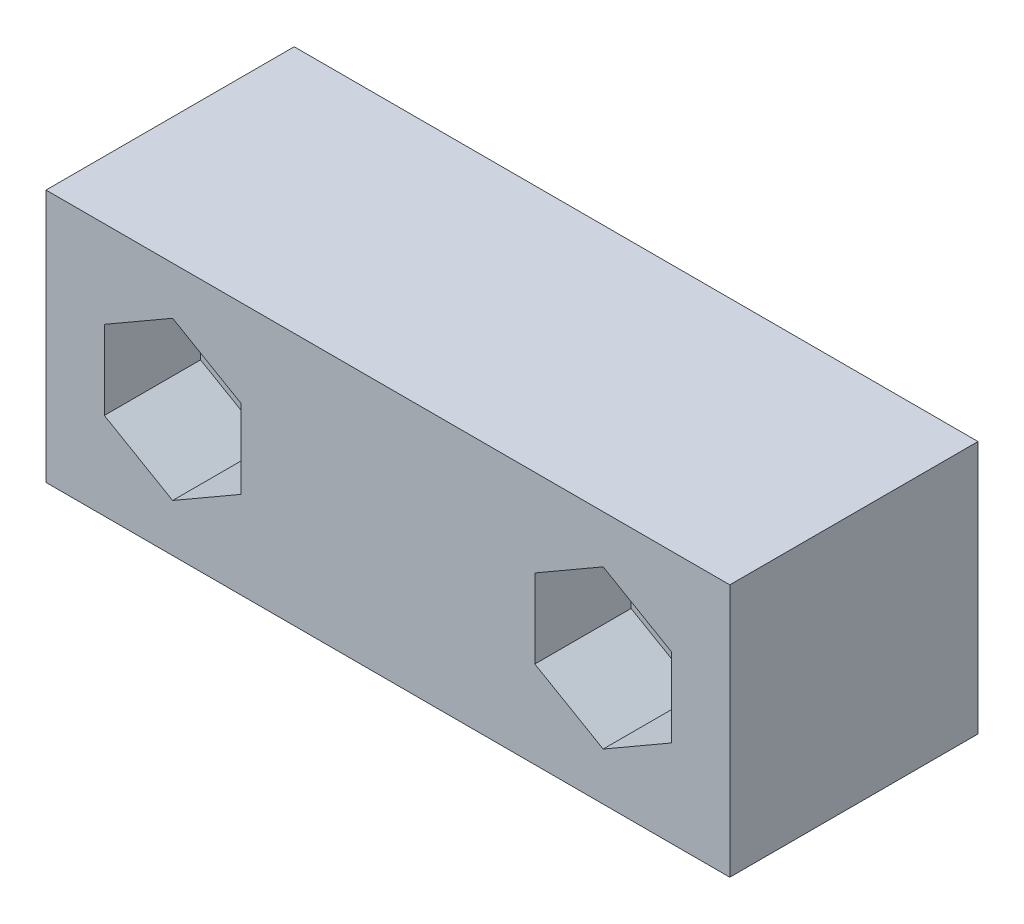
ISO-10303-21;
HEADER;
FILE_DESCRIPTION(('STEP AP214'),'2;1');
FILE_NAME('part.step','',(''),(''),'','','');
FILE_SCHEMA(('AUTOMOTIVE_DESIGN { 1 0 10303 214 1 1 1 1 }'));
ENDSEC;
DATA;
#1=APPLICATION_CONTEXT('core data for automotive mechanical design processes');
#2=APPLICATION_PROTOCOL_DEFINITION('international standard','automotive_design',2000,#1);
#3=PRODUCT_CONTEXT('',#1,'mechanical');
#4=PRODUCT('Part','Part','',(#3));
#5=PRODUCT_RELATED_PRODUCT_CATEGORY('part','',(#4));
#6=PRODUCT_DEFINITION_FORMATION('','',#4);
#7=PRODUCT_DEFINITION_CONTEXT('part definition',#1,'design');
#8=PRODUCT_DEFINITION('design','',#6,#7);
#9=PRODUCT_DEFINITION_SHAPE('','',#8);
#10=(LENGTH_UNIT() NAMED_UNIT(*) SI_UNIT(.MILLI.,.METRE.));
#11=(NAMED_UNIT(*) PLANE_ANGLE_UNIT() SI_UNIT($,.RADIAN.));
#12=(NAMED_UNIT(*) SI_UNIT($,.STERADIAN.) SOLID_ANGLE_UNIT());
#13=UNCERTAINTY_MEASURE_WITH_UNIT(LENGTH_MEASURE(1.E-05),#10,'distance_accuracy_value','');
#14=(GEOMETRIC_REPRESENTATION_CONTEXT(3) GLOBAL_UNCERTAINTY_ASSIGNED_CONTEXT((#13)) GLOBAL_UNIT_ASSIGNED_CONTEXT((#10,
#11,#12)) REPRESENTATION_CONTEXT('',''));
#15=CARTESIAN_POINT('',(0.,0.,0.));
#16=DIRECTION('',(0.,0.,1.));
#17=DIRECTION('',(1.,0.,0.));
#18=AXIS2_PLACEMENT_3D('',#15,#16,#17);
#19=CARTESIAN_POINT('',(22.,-5.,9.8));
#20=DIRECTION('',(0.,-1.,0.));
#21=DIRECTION('',(1.,0.,0.));
#22=AXIS2_PLACEMENT_3D('',#19,#20,#21);
#23=PLANE('',#22);
#24=DIRECTION('',(-1.,0.,0.));
#25=VECTOR('',#24,1.);
#26=CARTESIAN_POINT('',(22.,-5.,0.));
#27=LINE('',#26,#25);
#28=CARTESIAN_POINT('',(22.,-5.,0.));
#29=VERTEX_POINT('',#28);
#30=CARTESIAN_POINT('',(-5.,-5.,0.));
#31=VERTEX_POINT('',#30);
#32=EDGE_CURVE('E240',#29,#31,#27,.T.);
#33=ORIENTED_EDGE('',*,*,#32,.F.);
#34=DIRECTION('',(0.,0.,-1.));
#35=VECTOR('',#34,1.);
#36=CARTESIAN_POINT('',(22.,-5.,9.8));
#37=LINE('',#36,#35);
#38=CARTESIAN_POINT('',(22.,-5.,9.8));
#39=VERTEX_POINT('',#38);
#40=EDGE_CURVE('E11',#39,#29,#37,.T.);
#41=ORIENTED_EDGE('',*,*,#40,.F.);
#42=DIRECTION('',(-1.,0.,0.));
#43=VECTOR('',#42,1.);
#44=CARTESIAN_POINT('',(22.,-5.,9.8));
#45=LINE('',#44,#43);
#46=CARTESIAN_POINT('',(-5.,-5.,9.8));
#47=VERTEX_POINT('',#46);
#48=EDGE_CURVE('E250',#39,#47,#45,.T.);
#49=ORIENTED_EDGE('',*,*,#48,.T.);
#50=DIRECTION('',(0.,0.,-1.));
#51=VECTOR('',#50,1.);
#52=CARTESIAN_POINT('',(-5.,-5.,9.8));
#53=LINE('',#52,#51);
#54=EDGE_CURVE('E263',#47,#31,#53,.T.);
#55=ORIENTED_EDGE('',*,*,#54,.T.);
#56=EDGE_LOOP('',(#33,#41,#49,#55));
#57=FACE_BOUND('',#56,.T.);
#58=ADVANCED_FACE('F32',(#57),#23,.T.);
#59=CARTESIAN_POINT('',(22.,5.,9.8));
#60=DIRECTION('',(1.,0.,0.));
#61=DIRECTION('',(0.,0.,-1.));
#62=AXIS2_PLACEMENT_3D('',#59,#60,#61);
#63=PLANE('',#62);
#64=DIRECTION('',(0.,-1.,0.));
#65=VECTOR('',#64,1.);
#66=CARTESIAN_POINT('',(22.,5.,0.));
#67=LINE('',#66,#65);
#68=CARTESIAN_POINT('',(22.,5.,0.));
#69=VERTEX_POINT('',#68);
#70=EDGE_CURVE('E254',#69,#29,#67,.T.);
#71=ORIENTED_EDGE('',*,*,#70,.F.);
#72=DIRECTION('',(0.,0.,-1.));
#73=VECTOR('',#72,1.);
#74=CARTESIAN_POINT('',(22.,5.,9.8));
#75=LINE('',#74,#73);
#76=CARTESIAN_POINT('',(22.,5.,9.8));
#77=VERTEX_POINT('',#76);
#78=EDGE_CURVE('E40',#77,#69,#75,.T.);
#79=ORIENTED_EDGE('',*,*,#78,.F.);
#80=DIRECTION('',(0.,-1.,0.));
#81=VECTOR('',#80,1.);
#82=CARTESIAN_POINT('',(22.,5.,9.8));
#83=LINE('',#82,#81);
#84=EDGE_CURVE('E260',#77,#39,#83,.T.);
#85=ORIENTED_EDGE('',*,*,#84,.T.);
#86=ORIENTED_EDGE('',*,*,#40,.T.);
#87=EDGE_LOOP('',(#71,#79,#85,#86));
#88=FACE_BOUND('',#87,.T.);
#89=ADVANCED_FACE('F312',(#88),#63,.T.);
#90=CARTESIAN_POINT('',(-5.,5.,9.8));
#91=DIRECTION('',(0.,1.,0.));
#92=DIRECTION('',(0.,0.,1.));
#93=AXIS2_PLACEMENT_3D('',#90,#91,#92);
#94=PLANE('',#93);
#95=DIRECTION('',(1.,0.,0.));
#96=VECTOR('',#95,1.);
#97=CARTESIAN_POINT('',(-5.,5.,0.));
#98=LINE('',#97,#96);
#99=CARTESIAN_POINT('',(-5.,5.,0.));
#100=VERTEX_POINT('',#99);
#101=EDGE_CURVE('E269',#100,#69,#98,.T.);
#102=ORIENTED_EDGE('',*,*,#101,.F.);
#103=DIRECTION('',(0.,0.,-1.));
#104=VECTOR('',#103,1.);
#105=CARTESIAN_POINT('',(-5.,5.,9.8));
#106=LINE('',#105,#104);
#107=CARTESIAN_POINT('',(-5.,5.,9.8));
#108=VERTEX_POINT('',#107);
#109=EDGE_CURVE('E275',#108,#100,#106,.T.);
#110=ORIENTED_EDGE('',*,*,#109,.F.);
#111=DIRECTION('',(1.,0.,0.));
#112=VECTOR('',#111,1.);
#113=CARTESIAN_POINT('',(-5.,5.,9.8));
#114=LINE('',#113,#112);
#115=EDGE_CURVE('E257',#108,#77,#114,.T.);
#116=ORIENTED_EDGE('',*,*,#115,.T.);
#117=ORIENTED_EDGE('',*,*,#78,.T.);
#118=EDGE_LOOP('',(#102,#110,#116,#117));
#119=FACE_BOUND('',#118,.T.);
#120=ADVANCED_FACE('F310',(#119),#94,.T.);
#121=CARTESIAN_POINT('',(-5.,-5.,9.8));
#122=DIRECTION('',(-1.,0.,0.));
#123=DIRECTION('',(0.,-1.,0.));
#124=AXIS2_PLACEMENT_3D('',#121,#122,#123);
#125=PLANE('',#124);
#126=DIRECTION('',(0.,1.,0.));
#127=VECTOR('',#126,1.);
#128=CARTESIAN_POINT('',(-5.,-5.,0.));
#129=LINE('',#128,#127);
#130=EDGE_CURVE('E266',#31,#100,#129,.T.);
#131=ORIENTED_EDGE('',*,*,#130,.F.);
#132=ORIENTED_EDGE('',*,*,#54,.F.);
#133=DIRECTION('',(0.,1.,0.));
#134=VECTOR('',#133,1.);
#135=CARTESIAN_POINT('',(-5.,-5.,9.8));
#136=LINE('',#135,#134);
#137=EDGE_CURVE('E253',#47,#108,#136,.T.);
#138=ORIENTED_EDGE('',*,*,#137,.T.);
#139=ORIENTED_EDGE('',*,*,#109,.T.);
#140=EDGE_LOOP('',(#131,#132,#138,#139));
#141=FACE_BOUND('',#140,.T.);
#142=ADVANCED_FACE('F306',(#141),#125,.T.);
#143=CARTESIAN_POINT('',(-5.,-5.,9.8));
#144=DIRECTION('',(0.,0.,-1.));
#145=DIRECTION('',(-1.,0.,0.));
#146=AXIS2_PLACEMENT_3D('',#143,#144,#145);
#147=PLANE('',#146);
#148=DIRECTION('',(0.866025403784438,-0.5,0.));
#149=VECTOR('',#148,1.);
#150=CARTESIAN_POINT('',(14.3019237886462,-1.55773502691925,9.8));
#151=LINE('',#150,#149);
#152=CARTESIAN_POINT('',(14.3019237886462,-1.55773502691925,9.8));
#153=VERTEX_POINT('',#152);
#154=CARTESIAN_POINT('',(17.,-3.11547005383851,9.8));
#155=VERTEX_POINT('',#154);
#156=EDGE_CURVE('E183',#153,#155,#151,.T.);
#157=ORIENTED_EDGE('',*,*,#156,.F.);
#158=DIRECTION('',(0.,-1.,0.));
#159=VECTOR('',#158,1.);
#160=CARTESIAN_POINT('',(14.3019237886462,1.55773502691925,9.8));
#161=LINE('',#160,#159);
#162=CARTESIAN_POINT('',(14.3019237886462,1.55773502691925,9.8));
#163=VERTEX_POINT('',#162);
#164=EDGE_CURVE('E48',#163,#153,#161,.T.);
#165=ORIENTED_EDGE('',*,*,#164,.F.);
#166=DIRECTION('',(-0.866025403784438,-0.500000000000001,0.));
#167=VECTOR('',#166,1.);
#168=CARTESIAN_POINT('',(17.,3.11547005383851,9.8));
#169=LINE('',#168,#167);
#170=CARTESIAN_POINT('',(17.,3.11547005383851,9.8));
#171=VERTEX_POINT('',#170);
#172=EDGE_CURVE('E166',#171,#163,#169,.T.);
#173=ORIENTED_EDGE('',*,*,#172,.F.);
#174=DIRECTION('',(-0.866025403784439,0.499999999999999,0.));
#175=VECTOR('',#174,1.);
#176=CARTESIAN_POINT('',(19.6980762113538,1.55773502691926,9.8));
#177=LINE('',#176,#175);
#178=CARTESIAN_POINT('',(19.6980762113538,1.55773502691926,9.8));
#179=VERTEX_POINT('',#178);
#180=EDGE_CURVE('E169',#179,#171,#177,.T.);
#181=ORIENTED_EDGE('',*,*,#180,.F.);
#182=DIRECTION('',(0.,1.,0.));
#183=VECTOR('',#182,1.);
#184=CARTESIAN_POINT('',(19.6980762113538,-1.55773502691925,9.8));
#185=LINE('',#184,#183);
#186=CARTESIAN_POINT('',(19.6980762113538,-1.55773502691925,9.8));
#187=VERTEX_POINT('',#186);
#188=EDGE_CURVE('E189',#187,#179,#185,.T.);
#189=ORIENTED_EDGE('',*,*,#188,.F.);
#190=DIRECTION('',(0.866025403784438,0.500000000000001,0.));
#191=VECTOR('',#190,1.);
#192=CARTESIAN_POINT('',(17.,-3.11547005383851,9.8));
#193=LINE('',#192,#191);
#194=EDGE_CURVE('E186',#155,#187,#193,.T.);
#195=ORIENTED_EDGE('',*,*,#194,.F.);
#196=EDGE_LOOP('',(#157,#165,#173,#181,#189,#195));
#197=FACE_BOUND('',#196,.T.);
#198=DIRECTION('',(0.866025403784438,-0.5,0.));
#199=VECTOR('',#198,1.);
#200=CARTESIAN_POINT('',(-2.69807621135381,-1.55773502691925,9.8));
#201=LINE('',#200,#199);
#202=CARTESIAN_POINT('',(-2.69807621135381,-1.55773502691925,9.8));
#203=VERTEX_POINT('',#202);
#204=CARTESIAN_POINT('',(0.,-3.11547005383851,9.8));
#205=VERTEX_POINT('',#204);
#206=EDGE_CURVE('E224',#203,#205,#201,.T.);
#207=ORIENTED_EDGE('',*,*,#206,.F.);
#208=DIRECTION('',(0.,-1.,0.));
#209=VECTOR('',#208,1.);
#210=CARTESIAN_POINT('',(-2.69807621135381,1.55773502691925,9.8));
#211=LINE('',#210,#209);
#212=CARTESIAN_POINT('',(-2.69807621135381,1.55773502691925,9.8));
#213=VERTEX_POINT('',#212);
#214=EDGE_CURVE('E56',#213,#203,#211,.T.);
#215=ORIENTED_EDGE('',*,*,#214,.F.);
#216=DIRECTION('',(-0.866025403784438,-0.500000000000001,0.));
#217=VECTOR('',#216,1.);
#218=CARTESIAN_POINT('',(0.,3.11547005383851,9.8));
#219=LINE('',#218,#217);
#220=CARTESIAN_POINT('',(0.,3.11547005383851,9.8));
#221=VERTEX_POINT('',#220);
#222=EDGE_CURVE('E207',#221,#213,#219,.T.);
#223=ORIENTED_EDGE('',*,*,#222,.F.);
#224=DIRECTION('',(-0.866025403784439,0.499999999999998,0.));
#225=VECTOR('',#224,1.);
#226=CARTESIAN_POINT('',(2.69807621135383,1.55773502691926,9.8));
#227=LINE('',#226,#225);
#228=CARTESIAN_POINT('',(2.69807621135383,1.55773502691926,9.8));
#229=VERTEX_POINT('',#228);
#230=EDGE_CURVE('E233',#229,#221,#227,.T.);
#231=ORIENTED_EDGE('',*,*,#230,.F.);
#232=DIRECTION('',(0.,1.,0.));
#233=VECTOR('',#232,1.);
#234=CARTESIAN_POINT('',(2.69807621135383,-1.55773502691925,9.8));
#235=LINE('',#234,#233);
#236=CARTESIAN_POINT('',(2.69807621135383,-1.55773502691925,9.8));
#237=VERTEX_POINT('',#236);
#238=EDGE_CURVE('E230',#237,#229,#235,.T.);
#239=ORIENTED_EDGE('',*,*,#238,.F.);
#240=DIRECTION('',(0.866025403784438,0.500000000000001,0.));
#241=VECTOR('',#240,1.);
#242=CARTESIAN_POINT('',(0.,-3.11547005383851,9.8));
#243=LINE('',#242,#241);
#244=EDGE_CURVE('E227',#205,#237,#243,.T.);
#245=ORIENTED_EDGE('',*,*,#244,.F.);
#246=EDGE_LOOP('',(#207,#215,#223,#231,#239,#245));
#247=FACE_BOUND('',#246,.T.);
#248=ORIENTED_EDGE('',*,*,#48,.F.);
#249=ORIENTED_EDGE('',*,*,#84,.F.);
#250=ORIENTED_EDGE('',*,*,#115,.F.);
#251=ORIENTED_EDGE('',*,*,#137,.F.);
#252=EDGE_LOOP('',(#248,#249,#250,#251));
#253=FACE_BOUND('',#252,.T.);
#254=ADVANCED_FACE('F296',(#197,#247,#253),#147,.F.);
#255=CARTESIAN_POINT('',(-5.,-5.,0.));
#256=DIRECTION('',(0.,0.,-1.));
#257=DIRECTION('',(-1.,0.,0.));
#258=AXIS2_PLACEMENT_3D('',#255,#256,#257);
#259=PLANE('',#258);
#260=CARTESIAN_POINT('',(17.,0.,0.));
#261=DIRECTION('',(0.,0.,-1.));
#262=DIRECTION('',(-1.,0.,0.));
#263=AXIS2_PLACEMENT_3D('',#260,#261,#262);
#264=CIRCLE('',#263,1.70000000000001);
#265=CARTESIAN_POINT('',(15.3,0.,0.));
#266=VERTEX_POINT('',#265);
#267=EDGE_CURVE('E284',#266,#266,#264,.T.);
#268=ORIENTED_EDGE('',*,*,#267,.F.);
#269=EDGE_LOOP('',(#268));
#270=FACE_BOUND('',#269,.T.);
#271=CARTESIAN_POINT('',(0.,0.,0.));
#272=DIRECTION('',(0.,0.,-1.));
#273=DIRECTION('',(-1.,0.,0.));
#274=AXIS2_PLACEMENT_3D('',#271,#272,#273);
#275=CIRCLE('',#274,1.70000000000001);
#276=CARTESIAN_POINT('',(-1.70000000000001,0.,0.));
#277=VERTEX_POINT('',#276);
#278=EDGE_CURVE('E172',#277,#277,#275,.T.);
#279=ORIENTED_EDGE('',*,*,#278,.F.);
#280=EDGE_LOOP('',(#279));
#281=FACE_BOUND('',#280,.T.);
#282=ORIENTED_EDGE('',*,*,#32,.T.);
#283=ORIENTED_EDGE('',*,*,#130,.T.);
#284=ORIENTED_EDGE('',*,*,#101,.T.);
#285=ORIENTED_EDGE('',*,*,#70,.T.);
#286=EDGE_LOOP('',(#282,#283,#284,#285));
#287=FACE_BOUND('',#286,.T.);
#288=ADVANCED_FACE('F292',(#270,#281,#287),#259,.T.);
#289=CARTESIAN_POINT('',(-2.69807621135381,1.55773502691925,6.));
#290=DIRECTION('',(-1.,0.,0.));
#291=DIRECTION('',(0.,-1.,0.));
#292=AXIS2_PLACEMENT_3D('',#289,#290,#291);
#293=PLANE('',#292);
#294=ORIENTED_EDGE('',*,*,#214,.T.);
#295=DIRECTION('',(0.,0.,1.));
#296=VECTOR('',#295,1.);
#297=CARTESIAN_POINT('',(-2.69807621135381,-1.55773502691925,6.));
#298=LINE('',#297,#296);
#299=CARTESIAN_POINT('',(-2.69807621135381,-1.55773502691925,6.));
#300=VERTEX_POINT('',#299);
#301=EDGE_CURVE('E222',#300,#203,#298,.T.);
#302=ORIENTED_EDGE('',*,*,#301,.F.);
#303=DIRECTION('',(0.,-1.,0.));
#304=VECTOR('',#303,1.);
#305=CARTESIAN_POINT('',(-2.69807621135381,1.55773502691925,6.));
#306=LINE('',#305,#304);
#307=CARTESIAN_POINT('',(-2.69807621135381,1.55773502691925,6.));
#308=VERTEX_POINT('',#307);
#309=EDGE_CURVE('E203',#308,#300,#306,.T.);
#310=ORIENTED_EDGE('',*,*,#309,.F.);
#311=DIRECTION('',(0.,0.,1.));
#312=VECTOR('',#311,1.);
#313=CARTESIAN_POINT('',(-2.69807621135381,1.55773502691925,6.));
#314=LINE('',#313,#312);
#315=EDGE_CURVE('E238',#308,#213,#314,.T.);
#316=ORIENTED_EDGE('',*,*,#315,.T.);
#317=EDGE_LOOP('',(#294,#302,#310,#316));
#318=FACE_BOUND('',#317,.T.);
#319=ADVANCED_FACE('F295',(#318),#293,.F.);
#320=CARTESIAN_POINT('',(0.,3.11547005383851,6.));
#321=DIRECTION('',(-0.500000000000001,0.866025403784438,0.));
#322=DIRECTION('',(-0.866025403784438,-0.500000000000001,0.));
#323=AXIS2_PLACEMENT_3D('',#320,#321,#322);
#324=PLANE('',#323);
#325=ORIENTED_EDGE('',*,*,#222,.T.);
#326=ORIENTED_EDGE('',*,*,#315,.F.);
#327=DIRECTION('',(-0.866025403784438,-0.500000000000001,0.));
#328=VECTOR('',#327,1.);
#329=CARTESIAN_POINT('',(0.,3.11547005383851,6.));
#330=LINE('',#329,#328);
#331=CARTESIAN_POINT('',(0.,3.11547005383851,6.));
#332=VERTEX_POINT('',#331);
#333=EDGE_CURVE('E219',#332,#308,#330,.T.);
#334=ORIENTED_EDGE('',*,*,#333,.F.);
#335=DIRECTION('',(0.,0.,1.));
#336=VECTOR('',#335,1.);
#337=CARTESIAN_POINT('',(0.,3.11547005383851,6.));
#338=LINE('',#337,#336);
#339=EDGE_CURVE('E241',#332,#221,#338,.T.);
#340=ORIENTED_EDGE('',*,*,#339,.T.);
#341=EDGE_LOOP('',(#325,#326,#334,#340));
#342=FACE_BOUND('',#341,.T.);
#343=ADVANCED_FACE('F348',(#342),#324,.F.);
#344=CARTESIAN_POINT('',(2.69807621135383,1.55773502691926,6.));
#345=DIRECTION('',(0.499999999999999,0.86602540378444,0.));
#346=DIRECTION('',(-0.86602540378444,0.499999999999999,0.));
#347=AXIS2_PLACEMENT_3D('',#344,#345,#346);
#348=PLANE('',#347);
#349=ORIENTED_EDGE('',*,*,#230,.T.);
#350=ORIENTED_EDGE('',*,*,#339,.F.);
#351=DIRECTION('',(-0.866025403784439,0.499999999999998,0.));
#352=VECTOR('',#351,1.);
#353=CARTESIAN_POINT('',(2.69807621135383,1.55773502691926,6.));
#354=LINE('',#353,#352);
#355=CARTESIAN_POINT('',(2.69807621135383,1.55773502691926,6.));
#356=VERTEX_POINT('',#355);
#357=EDGE_CURVE('E216',#356,#332,#354,.T.);
#358=ORIENTED_EDGE('',*,*,#357,.F.);
#359=DIRECTION('',(0.,0.,1.));
#360=VECTOR('',#359,1.);
#361=CARTESIAN_POINT('',(2.69807621135383,1.55773502691926,6.));
#362=LINE('',#361,#360);
#363=EDGE_CURVE('E243',#356,#229,#362,.T.);
#364=ORIENTED_EDGE('',*,*,#363,.T.);
#365=EDGE_LOOP('',(#349,#350,#358,#364));
#366=FACE_BOUND('',#365,.T.);
#367=ADVANCED_FACE('F357',(#366),#348,.F.);
#368=CARTESIAN_POINT('',(2.69807621135383,-1.55773502691925,6.));
#369=DIRECTION('',(1.,0.,0.));
#370=DIRECTION('',(0.,1.,0.));
#371=AXIS2_PLACEMENT_3D('',#368,#369,#370);
#372=PLANE('',#371);
#373=ORIENTED_EDGE('',*,*,#238,.T.);
#374=ORIENTED_EDGE('',*,*,#363,.F.);
#375=DIRECTION('',(0.,1.,0.));
#376=VECTOR('',#375,1.);
#377=CARTESIAN_POINT('',(2.69807621135383,-1.55773502691925,6.));
#378=LINE('',#377,#376);
#379=CARTESIAN_POINT('',(2.69807621135383,-1.55773502691925,6.));
#380=VERTEX_POINT('',#379);
#381=EDGE_CURVE('E213',#380,#356,#378,.T.);
#382=ORIENTED_EDGE('',*,*,#381,.F.);
#383=DIRECTION('',(0.,0.,1.));
#384=VECTOR('',#383,1.);
#385=CARTESIAN_POINT('',(2.69807621135383,-1.55773502691925,6.));
#386=LINE('',#385,#384);
#387=EDGE_CURVE('E245',#380,#237,#386,.T.);
#388=ORIENTED_EDGE('',*,*,#387,.T.);
#389=EDGE_LOOP('',(#373,#374,#382,#388));
#390=FACE_BOUND('',#389,.T.);
#391=ADVANCED_FACE('F367',(#390),#372,.F.);
#392=CARTESIAN_POINT('',(0.,-3.11547005383851,6.));
#393=DIRECTION('',(0.500000000000001,-0.866025403784438,0.));
#394=DIRECTION('',(0.866025403784438,0.500000000000001,0.));
#395=AXIS2_PLACEMENT_3D('',#392,#393,#394);
#396=PLANE('',#395);
#397=ORIENTED_EDGE('',*,*,#244,.T.);
#398=ORIENTED_EDGE('',*,*,#387,.F.);
#399=DIRECTION('',(0.866025403784438,0.500000000000001,0.));
#400=VECTOR('',#399,1.);
#401=CARTESIAN_POINT('',(0.,-3.11547005383851,6.));
#402=LINE('',#401,#400);
#403=CARTESIAN_POINT('',(0.,-3.11547005383851,6.));
#404=VERTEX_POINT('',#403);
#405=EDGE_CURVE('E210',#404,#380,#402,.T.);
#406=ORIENTED_EDGE('',*,*,#405,.F.);
#407=DIRECTION('',(0.,0.,1.));
#408=VECTOR('',#407,1.);
#409=CARTESIAN_POINT('',(0.,-3.11547005383851,6.));
#410=LINE('',#409,#408);
#411=EDGE_CURVE('E247',#404,#205,#410,.T.);
#412=ORIENTED_EDGE('',*,*,#411,.T.);
#413=EDGE_LOOP('',(#397,#398,#406,#412));
#414=FACE_BOUND('',#413,.T.);
#415=ADVANCED_FACE('F377',(#414),#396,.F.);
#416=CARTESIAN_POINT('',(-2.69807621135381,-1.55773502691925,6.));
#417=DIRECTION('',(-0.5,-0.866025403784439,0.));
#418=DIRECTION('',(0.866025403784439,-0.5,0.));
#419=AXIS2_PLACEMENT_3D('',#416,#417,#418);
#420=PLANE('',#419);
#421=ORIENTED_EDGE('',*,*,#206,.T.);
#422=ORIENTED_EDGE('',*,*,#411,.F.);
#423=DIRECTION('',(0.866025403784438,-0.5,0.));
#424=VECTOR('',#423,1.);
#425=CARTESIAN_POINT('',(-2.69807621135381,-1.55773502691925,6.));
#426=LINE('',#425,#424);
#427=EDGE_CURVE('E206',#300,#404,#426,.T.);
#428=ORIENTED_EDGE('',*,*,#427,.F.);
#429=ORIENTED_EDGE('',*,*,#301,.T.);
#430=EDGE_LOOP('',(#421,#422,#428,#429));
#431=FACE_BOUND('',#430,.T.);
#432=ADVANCED_FACE('F387',(#431),#420,.F.);
#433=CARTESIAN_POINT('',(-2.69807621135381,-1.55773502691925,6.));
#434=DIRECTION('',(0.,0.,1.));
#435=DIRECTION('',(1.,0.,0.));
#436=AXIS2_PLACEMENT_3D('',#433,#434,#435);
#437=PLANE('',#436);
#438=CARTESIAN_POINT('',(0.,0.,6.));
#439=DIRECTION('',(0.,0.,1.));
#440=DIRECTION('',(1.,0.,0.));
#441=AXIS2_PLACEMENT_3D('',#438,#439,#440);
#442=CIRCLE('',#441,1.70000000000001);
#443=CARTESIAN_POINT('',(1.70000000000001,0.,6.));
#444=VERTEX_POINT('',#443);
#445=EDGE_CURVE('E184',#444,#444,#442,.T.);
#446=ORIENTED_EDGE('',*,*,#445,.F.);
#447=EDGE_LOOP('',(#446));
#448=FACE_BOUND('',#447,.T.);
#449=ORIENTED_EDGE('',*,*,#309,.T.);
#450=ORIENTED_EDGE('',*,*,#427,.T.);
#451=ORIENTED_EDGE('',*,*,#405,.T.);
#452=ORIENTED_EDGE('',*,*,#381,.T.);
#453=ORIENTED_EDGE('',*,*,#357,.T.);
#454=ORIENTED_EDGE('',*,*,#333,.T.);
#455=EDGE_LOOP('',(#449,#450,#451,#452,#453,#454));
#456=FACE_BOUND('',#455,.T.);
#457=ADVANCED_FACE('F396',(#448,#456),#437,.T.);
#458=CARTESIAN_POINT('',(14.3019237886462,1.55773502691925,6.));
#459=DIRECTION('',(-1.,0.,0.));
#460=DIRECTION('',(0.,-1.,0.));
#461=AXIS2_PLACEMENT_3D('',#458,#459,#460);
#462=PLANE('',#461);
#463=ORIENTED_EDGE('',*,*,#164,.T.);
#464=DIRECTION('',(0.,0.,1.));
#465=VECTOR('',#464,1.);
#466=CARTESIAN_POINT('',(14.3019237886462,-1.55773502691925,6.));
#467=LINE('',#466,#465);
#468=CARTESIAN_POINT('',(14.3019237886462,-1.55773502691925,6.));
#469=VERTEX_POINT('',#468);
#470=EDGE_CURVE('E143',#469,#153,#467,.T.);
#471=ORIENTED_EDGE('',*,*,#470,.F.);
#472=DIRECTION('',(0.,-1.,0.));
#473=VECTOR('',#472,1.);
#474=CARTESIAN_POINT('',(14.3019237886462,1.55773502691925,6.));
#475=LINE('',#474,#473);
#476=CARTESIAN_POINT('',(14.3019237886462,1.55773502691925,6.));
#477=VERTEX_POINT('',#476);
#478=EDGE_CURVE('E147',#477,#469,#475,.T.);
#479=ORIENTED_EDGE('',*,*,#478,.F.);
#480=DIRECTION('',(0.,0.,1.));
#481=VECTOR('',#480,1.);
#482=CARTESIAN_POINT('',(14.3019237886462,1.55773502691925,6.));
#483=LINE('',#482,#481);
#484=EDGE_CURVE('E194',#477,#163,#483,.T.);
#485=ORIENTED_EDGE('',*,*,#484,.T.);
#486=EDGE_LOOP('',(#463,#471,#479,#485));
#487=FACE_BOUND('',#486,.T.);
#488=ADVANCED_FACE('F145',(#487),#462,.F.);
#489=CARTESIAN_POINT('',(17.,3.11547005383851,6.));
#490=DIRECTION('',(-0.500000000000001,0.866025403784438,0.));
#491=DIRECTION('',(-0.866025403784438,-0.500000000000001,0.));
#492=AXIS2_PLACEMENT_3D('',#489,#490,#491);
#493=PLANE('',#492);
#494=ORIENTED_EDGE('',*,*,#172,.T.);
#495=ORIENTED_EDGE('',*,*,#484,.F.);
#496=DIRECTION('',(-0.866025403784438,-0.500000000000001,0.));
#497=VECTOR('',#496,1.);
#498=CARTESIAN_POINT('',(17.,3.11547005383851,6.));
#499=LINE('',#498,#497);
#500=CARTESIAN_POINT('',(17.,3.11547005383851,6.));
#501=VERTEX_POINT('',#500);
#502=EDGE_CURVE('E153',#501,#477,#499,.T.);
#503=ORIENTED_EDGE('',*,*,#502,.F.);
#504=DIRECTION('',(0.,0.,1.));
#505=VECTOR('',#504,1.);
#506=CARTESIAN_POINT('',(17.,3.11547005383851,6.));
#507=LINE('',#506,#505);
#508=EDGE_CURVE('E196',#501,#171,#507,.T.);
#509=ORIENTED_EDGE('',*,*,#508,.T.);
#510=EDGE_LOOP('',(#494,#495,#503,#509));
#511=FACE_BOUND('',#510,.T.);
#512=ADVANCED_FACE('F412',(#511),#493,.F.);
#513=CARTESIAN_POINT('',(19.6980762113538,1.55773502691926,6.));
#514=DIRECTION('',(0.499999999999999,0.866025403784439,0.));
#515=DIRECTION('',(-0.86602540378444,0.499999999999999,0.));
#516=AXIS2_PLACEMENT_3D('',#513,#514,#515);
#517=PLANE('',#516);
#518=ORIENTED_EDGE('',*,*,#180,.T.);
#519=ORIENTED_EDGE('',*,*,#508,.F.);
#520=DIRECTION('',(-0.866025403784439,0.499999999999999,0.));
#521=VECTOR('',#520,1.);
#522=CARTESIAN_POINT('',(19.6980762113538,1.55773502691926,6.));
#523=LINE('',#522,#521);
#524=CARTESIAN_POINT('',(19.6980762113538,1.55773502691926,6.));
#525=VERTEX_POINT('',#524);
#526=EDGE_CURVE('E179',#525,#501,#523,.T.);
#527=ORIENTED_EDGE('',*,*,#526,.F.);
#528=DIRECTION('',(0.,0.,1.));
#529=VECTOR('',#528,1.);
#530=CARTESIAN_POINT('',(19.6980762113538,1.55773502691926,6.));
#531=LINE('',#530,#529);
#532=EDGE_CURVE('E198',#525,#179,#531,.T.);
#533=ORIENTED_EDGE('',*,*,#532,.T.);
#534=EDGE_LOOP('',(#518,#519,#527,#533));
#535=FACE_BOUND('',#534,.T.);
#536=ADVANCED_FACE('F421',(#535),#517,.F.);
#537=CARTESIAN_POINT('',(19.6980762113538,-1.55773502691925,6.));
#538=DIRECTION('',(1.,0.,0.));
#539=DIRECTION('',(0.,1.,0.));
#540=AXIS2_PLACEMENT_3D('',#537,#538,#539);
#541=PLANE('',#540);
#542=ORIENTED_EDGE('',*,*,#188,.T.);
#543=ORIENTED_EDGE('',*,*,#532,.F.);
#544=DIRECTION('',(0.,1.,0.));
#545=VECTOR('',#544,1.);
#546=CARTESIAN_POINT('',(19.6980762113538,-1.55773502691925,6.));
#547=LINE('',#546,#545);
#548=CARTESIAN_POINT('',(19.6980762113538,-1.55773502691925,6.));
#549=VERTEX_POINT('',#548);
#550=EDGE_CURVE('E176',#549,#525,#547,.T.);
#551=ORIENTED_EDGE('',*,*,#550,.F.);
#552=DIRECTION('',(0.,0.,1.));
#553=VECTOR('',#552,1.);
#554=CARTESIAN_POINT('',(19.6980762113538,-1.55773502691925,6.));
#555=LINE('',#554,#553);
#556=EDGE_CURVE('E200',#549,#187,#555,.T.);
#557=ORIENTED_EDGE('',*,*,#556,.T.);
#558=EDGE_LOOP('',(#542,#543,#551,#557));
#559=FACE_BOUND('',#558,.T.);
#560=ADVANCED_FACE('F431',(#559),#541,.F.);
#561=CARTESIAN_POINT('',(17.,-3.11547005383851,6.));
#562=DIRECTION('',(0.500000000000001,-0.866025403784438,0.));
#563=DIRECTION('',(0.866025403784438,0.500000000000001,0.));
#564=AXIS2_PLACEMENT_3D('',#561,#562,#563);
#565=PLANE('',#564);
#566=ORIENTED_EDGE('',*,*,#194,.T.);
#567=ORIENTED_EDGE('',*,*,#556,.F.);
#568=DIRECTION('',(0.866025403784438,0.500000000000001,0.));
#569=VECTOR('',#568,1.);
#570=CARTESIAN_POINT('',(17.,-3.11547005383851,6.));
#571=LINE('',#570,#569);
#572=CARTESIAN_POINT('',(17.,-3.11547005383851,6.));
#573=VERTEX_POINT('',#572);
#574=EDGE_CURVE('E161',#573,#549,#571,.T.);
#575=ORIENTED_EDGE('',*,*,#574,.F.);
#576=DIRECTION('',(0.,0.,1.));
#577=VECTOR('',#576,1.);
#578=CARTESIAN_POINT('',(17.,-3.11547005383851,6.));
#579=LINE('',#578,#577);
#580=EDGE_CURVE('E152',#573,#155,#579,.T.);
#581=ORIENTED_EDGE('',*,*,#580,.T.);
#582=EDGE_LOOP('',(#566,#567,#575,#581));
#583=FACE_BOUND('',#582,.T.);
#584=ADVANCED_FACE('F441',(#583),#565,.F.);
#585=CARTESIAN_POINT('',(14.3019237886462,-1.55773502691925,6.));
#586=DIRECTION('',(-0.5,-0.866025403784439,0.));
#587=DIRECTION('',(0.866025403784439,-0.5,0.));
#588=AXIS2_PLACEMENT_3D('',#585,#586,#587);
#589=PLANE('',#588);
#590=ORIENTED_EDGE('',*,*,#156,.T.);
#591=ORIENTED_EDGE('',*,*,#580,.F.);
#592=DIRECTION('',(0.866025403784438,-0.5,0.));
#593=VECTOR('',#592,1.);
#594=CARTESIAN_POINT('',(14.3019237886462,-1.55773502691925,6.));
#595=LINE('',#594,#593);
#596=EDGE_CURVE('E156',#469,#573,#595,.T.);
#597=ORIENTED_EDGE('',*,*,#596,.F.);
#598=ORIENTED_EDGE('',*,*,#470,.T.);
#599=EDGE_LOOP('',(#590,#591,#597,#598));
#600=FACE_BOUND('',#599,.T.);
#601=ADVANCED_FACE('F157',(#600),#589,.F.);
#602=CARTESIAN_POINT('',(14.3019237886462,-1.55773502691925,6.));
#603=DIRECTION('',(0.,0.,1.));
#604=DIRECTION('',(1.,0.,0.));
#605=AXIS2_PLACEMENT_3D('',#602,#603,#604);
#606=PLANE('',#605);
#607=CARTESIAN_POINT('',(17.,0.,6.));
#608=DIRECTION('',(0.,0.,1.));
#609=DIRECTION('',(1.,0.,0.));
#610=AXIS2_PLACEMENT_3D('',#607,#608,#609);
#611=CIRCLE('',#610,1.70000000000001);
#612=CARTESIAN_POINT('',(18.7,0.,6.));
#613=VERTEX_POINT('',#612);
#614=EDGE_CURVE('E35',#613,#613,#611,.T.);
#615=ORIENTED_EDGE('',*,*,#614,.F.);
#616=EDGE_LOOP('',(#615));
#617=FACE_BOUND('',#616,.T.);
#618=ORIENTED_EDGE('',*,*,#478,.T.);
#619=ORIENTED_EDGE('',*,*,#596,.T.);
#620=ORIENTED_EDGE('',*,*,#574,.T.);
#621=ORIENTED_EDGE('',*,*,#550,.T.);
#622=ORIENTED_EDGE('',*,*,#526,.T.);
#623=ORIENTED_EDGE('',*,*,#502,.T.);
#624=EDGE_LOOP('',(#618,#619,#620,#621,#622,#623));
#625=FACE_BOUND('',#624,.T.);
#626=ADVANCED_FACE('F163',(#617,#625),#606,.T.);
#627=CARTESIAN_POINT('',(0.,0.,0.));
#628=DIRECTION('',(0.,0.,-1.));
#629=DIRECTION('',(-1.,0.,0.));
#630=AXIS2_PLACEMENT_3D('',#627,#628,#629);
#631=CYLINDRICAL_SURFACE('',#630,1.70000000000001);
#632=ORIENTED_EDGE('',*,*,#445,.T.);
#633=EDGE_LOOP('',(#632));
#634=FACE_BOUND('',#633,.T.);
#635=ORIENTED_EDGE('',*,*,#278,.T.);
#636=EDGE_LOOP('',(#635));
#637=FACE_BOUND('',#636,.T.);
#638=ADVANCED_FACE('F473',(#634,#637),#631,.F.);
#639=CARTESIAN_POINT('',(17.,0.,0.));
#640=DIRECTION('',(0.,0.,-1.));
#641=DIRECTION('',(-1.,0.,0.));
#642=AXIS2_PLACEMENT_3D('',#639,#640,#641);
#643=CYLINDRICAL_SURFACE('',#642,1.70000000000001);
#644=ORIENTED_EDGE('',*,*,#614,.T.);
#645=EDGE_LOOP('',(#644));
#646=FACE_BOUND('',#645,.T.);
#647=ORIENTED_EDGE('',*,*,#267,.T.);
#648=EDGE_LOOP('',(#647));
#649=FACE_BOUND('',#648,.T.);
#650=ADVANCED_FACE('F290',(#646,#649),#643,.F.);
#651=CLOSED_SHELL('',(#58,#89,#120,#142,#254,#288,#319,#343,#367,#391,#415,#432,#457,#488,#512,
#536,#560,#584,#601,#626,#638,#650));
#652=MANIFOLD_SOLID_BREP('B2',#651);
#653=ADVANCED_BREP_SHAPE_REPRESENTATION('',(#18,#652),#14);
#654=SHAPE_DEFINITION_REPRESENTATION(#9,#653);
ENDSEC;
END-ISO-10303-21;
